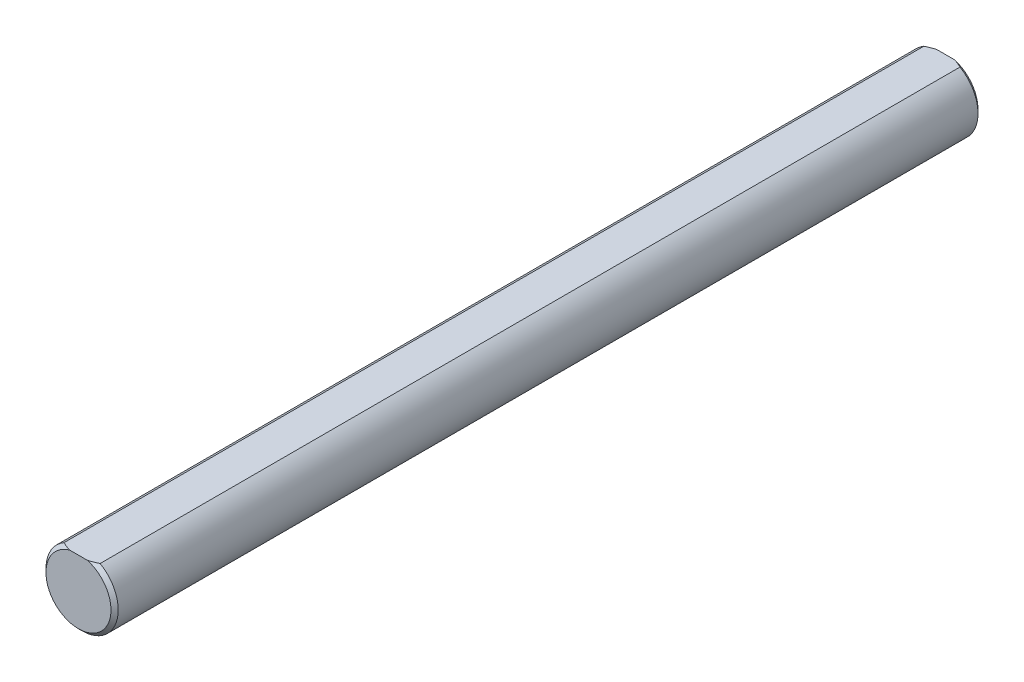
ISO-10303-21;
HEADER;
FILE_DESCRIPTION(('STEP AP214'),'2;1');
FILE_NAME('part.step','',(''),(''),'','','');
FILE_SCHEMA(('AUTOMOTIVE_DESIGN { 1 0 10303 214 1 1 1 1 }'));
ENDSEC;
DATA;
#1=APPLICATION_CONTEXT('core data for automotive mechanical design processes');
#2=APPLICATION_PROTOCOL_DEFINITION('international standard','automotive_design',2000,#1);
#3=PRODUCT_CONTEXT('',#1,'mechanical');
#4=PRODUCT('Part','Part','',(#3));
#5=PRODUCT_RELATED_PRODUCT_CATEGORY('part','',(#4));
#6=PRODUCT_DEFINITION_FORMATION('','',#4);
#7=PRODUCT_DEFINITION_CONTEXT('part definition',#1,'design');
#8=PRODUCT_DEFINITION('design','',#6,#7);
#9=PRODUCT_DEFINITION_SHAPE('','',#8);
#10=(LENGTH_UNIT() NAMED_UNIT(*) SI_UNIT(.MILLI.,.METRE.));
#11=(NAMED_UNIT(*) PLANE_ANGLE_UNIT() SI_UNIT($,.RADIAN.));
#12=(NAMED_UNIT(*) SI_UNIT($,.STERADIAN.) SOLID_ANGLE_UNIT());
#13=UNCERTAINTY_MEASURE_WITH_UNIT(LENGTH_MEASURE(1.E-05),#10,'distance_accuracy_value','');
#14=(GEOMETRIC_REPRESENTATION_CONTEXT(3) GLOBAL_UNCERTAINTY_ASSIGNED_CONTEXT((#13)) GLOBAL_UNIT_ASSIGNED_CONTEXT((#10,
#11,#12)) REPRESENTATION_CONTEXT('',''));
#15=CARTESIAN_POINT('',(0.,0.,0.));
#16=DIRECTION('',(0.,0.,1.));
#17=DIRECTION('',(1.,0.,0.));
#18=AXIS2_PLACEMENT_3D('',#15,#16,#17);
#19=CARTESIAN_POINT('',(0.,0.,76.2));
#20=DIRECTION('',(0.,0.,-1.));
#21=DIRECTION('',(-1.,0.,0.));
#22=AXIS2_PLACEMENT_3D('',#19,#20,#21);
#23=CYLINDRICAL_SURFACE('',#22,6.35);
#24=DIRECTION('',(0.,0.,1.));
#25=VECTOR('',#24,1.);
#26=CARTESIAN_POINT('',(-3.175,5.49926131403118,-76.2));
#27=LINE('',#26,#25);
#28=CARTESIAN_POINT('',(-3.175,5.49926131403118,-75.5649999999999));
#29=VERTEX_POINT('',#28);
#30=CARTESIAN_POINT('',(-3.175,5.49926131403118,75.565));
#31=VERTEX_POINT('',#30);
#32=EDGE_CURVE('E84',#29,#31,#27,.T.);
#33=ORIENTED_EDGE('',*,*,#32,.F.);
#34=CARTESIAN_POINT('',(0.,0.,-75.5649999999999));
#35=DIRECTION('',(0.,0.,1.));
#36=DIRECTION('',(1.,0.,0.));
#37=AXIS2_PLACEMENT_3D('',#34,#35,#36);
#38=CIRCLE('',#37,6.35);
#39=CARTESIAN_POINT('',(3.175,5.49926131403118,-75.5649999999999));
#40=VERTEX_POINT('',#39);
#41=EDGE_CURVE('E95',#29,#40,#38,.T.);
#42=ORIENTED_EDGE('',*,*,#41,.T.);
#43=DIRECTION('',(0.,0.,1.));
#44=VECTOR('',#43,1.);
#45=CARTESIAN_POINT('',(3.175,5.49926131403118,-76.2));
#46=LINE('',#45,#44);
#47=CARTESIAN_POINT('',(3.175,5.49926131403118,75.565));
#48=VERTEX_POINT('',#47);
#49=EDGE_CURVE('E97',#40,#48,#46,.T.);
#50=ORIENTED_EDGE('',*,*,#49,.T.);
#51=CARTESIAN_POINT('',(0.,0.,75.5650000000001));
#52=DIRECTION('',(0.,0.,1.));
#53=DIRECTION('',(1.,0.,0.));
#54=AXIS2_PLACEMENT_3D('',#51,#52,#53);
#55=CIRCLE('',#54,6.35);
#56=EDGE_CURVE('E96',#48,#31,#55,.F.);
#57=ORIENTED_EDGE('',*,*,#56,.T.);
#58=EDGE_LOOP('',(#33,#42,#50,#57));
#59=FACE_BOUND('',#58,.T.);
#60=ADVANCED_FACE('F37',(#59),#23,.T.);
#61=CARTESIAN_POINT('',(0.,0.,76.2));
#62=DIRECTION('',(0.,0.,1.));
#63=DIRECTION('',(1.,0.,0.));
#64=AXIS2_PLACEMENT_3D('',#61,#62,#63);
#65=PLANE('',#64);
#66=DIRECTION('',(1.,0.,0.));
#67=VECTOR('',#66,1.);
#68=CARTESIAN_POINT('',(-3.175,5.49926131403118,76.2));
#69=LINE('',#68,#67);
#70=CARTESIAN_POINT('',(-1.55542598666767,5.49926131403118,76.2));
#71=VERTEX_POINT('',#70);
#72=CARTESIAN_POINT('',(1.55542598666767,5.49926131403118,76.2));
#73=VERTEX_POINT('',#72);
#74=EDGE_CURVE('E142',#71,#73,#69,.T.);
#75=ORIENTED_EDGE('',*,*,#74,.F.);
#76=CARTESIAN_POINT('',(0.,0.,76.2));
#77=DIRECTION('',(0.,0.,1.));
#78=DIRECTION('',(1.,0.,0.));
#79=AXIS2_PLACEMENT_3D('',#76,#77,#78);
#80=CIRCLE('',#79,5.71500000000009);
#81=EDGE_CURVE('E11',#71,#73,#80,.T.);
#82=ORIENTED_EDGE('',*,*,#81,.T.);
#83=EDGE_LOOP('',(#75,#82));
#84=FACE_BOUND('',#83,.T.);
#85=ADVANCED_FACE('F135',(#84),#65,.T.);
#86=CARTESIAN_POINT('',(0.,0.,-76.2));
#87=DIRECTION('',(0.,0.,1.));
#88=DIRECTION('',(1.,0.,0.));
#89=AXIS2_PLACEMENT_3D('',#86,#87,#88);
#90=PLANE('',#89);
#91=DIRECTION('',(1.,0.,0.));
#92=VECTOR('',#91,1.);
#93=CARTESIAN_POINT('',(-3.175,5.49926131403118,-76.2));
#94=LINE('',#93,#92);
#95=CARTESIAN_POINT('',(-1.55542598666685,5.49926131403118,-76.2));
#96=VERTEX_POINT('',#95);
#97=CARTESIAN_POINT('',(1.55542598666685,5.49926131403118,-76.2));
#98=VERTEX_POINT('',#97);
#99=EDGE_CURVE('E86',#96,#98,#94,.T.);
#100=ORIENTED_EDGE('',*,*,#99,.T.);
#101=CARTESIAN_POINT('',(0.,0.,-76.2));
#102=DIRECTION('',(0.,0.,1.));
#103=DIRECTION('',(1.,0.,0.));
#104=AXIS2_PLACEMENT_3D('',#101,#102,#103);
#105=CIRCLE('',#104,5.71499999999987);
#106=EDGE_CURVE('E46',#98,#96,#105,.F.);
#107=ORIENTED_EDGE('',*,*,#106,.T.);
#108=EDGE_LOOP('',(#100,#107));
#109=FACE_BOUND('',#108,.T.);
#110=ADVANCED_FACE('F116',(#109),#90,.F.);
#111=CARTESIAN_POINT('',(-3.175,5.49926131403118,-76.2));
#112=DIRECTION('',(0.,-1.,0.));
#113=DIRECTION('',(0.,0.,-1.));
#114=AXIS2_PLACEMENT_3D('',#111,#112,#113);
#115=PLANE('',#114);
#116=ORIENTED_EDGE('',*,*,#49,.F.);
#117=CARTESIAN_POINT('',(3.175,5.49926131403118,-75.5649999999999));
#118=CARTESIAN_POINT('',(3.04501033398536,5.49926131403118,-75.6299761649596));
#119=CARTESIAN_POINT('',(2.91380376476052,5.49926131403118,-75.6926038152387));
#120=CARTESIAN_POINT('',(2.6491645415403,5.49926131403118,-75.8120517028503));
#121=CARTESIAN_POINT('',(2.51573807775448,5.49926131403118,-75.8688856940337));
#122=CARTESIAN_POINT('',(2.2461783600497,5.49926131403118,-75.9759840114088));
#123=CARTESIAN_POINT('',(2.11004398072325,5.49926131403118,-76.0262455374683));
#124=CARTESIAN_POINT('',(1.8348445135756,5.49926131403118,-76.1191643918951));
#125=CARTESIAN_POINT('',(1.69577308655063,5.49926131403118,-76.1618028710614));
#126=CARTESIAN_POINT('',(1.55542598666685,5.49926131403118,-76.2));
#127=B_SPLINE_CURVE_WITH_KNOTS('',3,(#117,#118,#119,#120,#121,#122,#123,#124,#125,#126),
.UNSPECIFIED.,.F.,.F.,(4,2,2,2,4),(0.,0.436005137555672,0.870949859794538,1.30607928626144,
1.7422701913616),.UNSPECIFIED.);
#128=EDGE_CURVE('E90',#40,#98,#127,.T.);
#129=ORIENTED_EDGE('',*,*,#128,.T.);
#130=ORIENTED_EDGE('',*,*,#99,.F.);
#131=CARTESIAN_POINT('',(-1.55542598666685,5.49926131403118,-76.2));
#132=CARTESIAN_POINT('',(-1.69577308655062,5.49926131403118,-76.1618028710614));
#133=CARTESIAN_POINT('',(-1.83484451357559,5.49926131403118,-76.1191643918951));
#134=CARTESIAN_POINT('',(-2.11004398072325,5.49926131403118,-76.0262455374683));
#135=CARTESIAN_POINT('',(-2.2461783600497,5.49926131403118,-75.9759840114088));
#136=CARTESIAN_POINT('',(-2.51573807775448,5.49926131403118,-75.8688856940337));
#137=CARTESIAN_POINT('',(-2.6491645415403,5.49926131403118,-75.8120517028503));
#138=CARTESIAN_POINT('',(-2.91380376476052,5.49926131403118,-75.6926038152387));
#139=CARTESIAN_POINT('',(-3.04501033398536,5.49926131403118,-75.6299761649596));
#140=CARTESIAN_POINT('',(-3.175,5.49926131403118,-75.5649999999999));
#141=B_SPLINE_CURVE_WITH_KNOTS('',3,(#131,#132,#133,#134,#135,#136,#137,#138,#139,#140),
.UNSPECIFIED.,.F.,.F.,(4,2,2,2,4),(0.,0.43619090510017,0.871320331567069,1.30626505380594,
1.74227019136161),.UNSPECIFIED.);
#142=EDGE_CURVE('E80',#96,#29,#141,.T.);
#143=ORIENTED_EDGE('',*,*,#142,.T.);
#144=ORIENTED_EDGE('',*,*,#32,.T.);
#145=CARTESIAN_POINT('',(-3.175,5.49926131403118,75.5650000000001));
#146=CARTESIAN_POINT('',(-3.04501033398542,5.49926131403118,75.6299761649598));
#147=CARTESIAN_POINT('',(-2.91380376476064,5.49926131403118,75.6926038152388));
#148=CARTESIAN_POINT('',(-2.64916454154055,5.49926131403118,75.8120517028504));
#149=CARTESIAN_POINT('',(-2.5157380777548,5.49926131403118,75.8688856940338));
#150=CARTESIAN_POINT('',(-2.24617836005016,5.49926131403118,75.9759840114088));
#151=CARTESIAN_POINT('',(-2.11004398072378,5.49926131403118,76.0262455374683));
#152=CARTESIAN_POINT('',(-1.83484451357627,5.49926131403118,76.1191643918951));
#153=CARTESIAN_POINT('',(-1.69577308655137,5.49926131403118,76.1618028710614));
#154=CARTESIAN_POINT('',(-1.55542598666767,5.49926131403118,76.2));
#155=B_SPLINE_CURVE_WITH_KNOTS('',3,(#145,#146,#147,#148,#149,#150,#151,#152,#153,#154),
.UNSPECIFIED.,.F.,.F.,(4,2,2,2,4),(0.,0.436005137555465,0.870949859794119,1.30607928626081,
1.74227019136076),.UNSPECIFIED.);
#156=EDGE_CURVE('E60',#31,#71,#155,.T.);
#157=ORIENTED_EDGE('',*,*,#156,.T.);
#158=ORIENTED_EDGE('',*,*,#74,.T.);
#159=CARTESIAN_POINT('',(1.55542598666767,5.49926131403118,76.2));
#160=CARTESIAN_POINT('',(1.69577308655137,5.49926131403118,76.1618028710614));
#161=CARTESIAN_POINT('',(1.83484451357627,5.49926131403118,76.1191643918951));
#162=CARTESIAN_POINT('',(2.11004398072378,5.49926131403118,76.0262455374683));
#163=CARTESIAN_POINT('',(2.24617836005016,5.49926131403118,75.9759840114088));
#164=CARTESIAN_POINT('',(2.5157380777548,5.49926131403118,75.8688856940338));
#165=CARTESIAN_POINT('',(2.64916454154055,5.49926131403118,75.8120517028504));
#166=CARTESIAN_POINT('',(2.91380376476064,5.49926131403118,75.6926038152388));
#167=CARTESIAN_POINT('',(3.04501033398542,5.49926131403118,75.6299761649598));
#168=CARTESIAN_POINT('',(3.175,5.49926131403118,75.5650000000001));
#169=B_SPLINE_CURVE_WITH_KNOTS('',3,(#159,#160,#161,#162,#163,#164,#165,#166,#167,#168),
.UNSPECIFIED.,.F.,.F.,(4,2,2,2,4),(0.,0.436190905099954,0.871320331566643,1.3062650538053,
1.74227019136076),.UNSPECIFIED.);
#170=EDGE_CURVE('E53',#73,#48,#169,.T.);
#171=ORIENTED_EDGE('',*,*,#170,.T.);
#172=EDGE_LOOP('',(#116,#129,#130,#143,#144,#157,#158,#171));
#173=FACE_BOUND('',#172,.T.);
#174=ADVANCED_FACE('F83',(#173),#115,.F.);
#175=CARTESIAN_POINT('',(0.,0.,-75.5649999999999));
#176=DIRECTION('',(0.,0.,1.));
#177=DIRECTION('',(1.,0.,0.));
#178=AXIS2_PLACEMENT_3D('',#175,#176,#177);
#179=CONICAL_SURFACE('',#178,6.35,0.785398163397442);
#180=ORIENTED_EDGE('',*,*,#142,.F.);
#181=ORIENTED_EDGE('',*,*,#106,.F.);
#182=ORIENTED_EDGE('',*,*,#128,.F.);
#183=ORIENTED_EDGE('',*,*,#41,.F.);
#184=EDGE_LOOP('',(#180,#181,#182,#183));
#185=FACE_BOUND('',#184,.T.);
#186=ADVANCED_FACE('F99',(#185),#179,.T.);
#187=CARTESIAN_POINT('',(0.,0.,76.2));
#188=DIRECTION('',(0.,0.,-1.));
#189=DIRECTION('',(-1.,0.,0.));
#190=AXIS2_PLACEMENT_3D('',#187,#188,#189);
#191=CONICAL_SURFACE('',#190,5.71500000000009,0.785398163397442);
#192=ORIENTED_EDGE('',*,*,#156,.F.);
#193=ORIENTED_EDGE('',*,*,#56,.F.);
#194=ORIENTED_EDGE('',*,*,#170,.F.);
#195=ORIENTED_EDGE('',*,*,#81,.F.);
#196=EDGE_LOOP('',(#192,#193,#194,#195));
#197=FACE_BOUND('',#196,.T.);
#198=ADVANCED_FACE('F39',(#197),#191,.T.);
#199=CLOSED_SHELL('',(#60,#85,#110,#174,#186,#198));
#200=MANIFOLD_SOLID_BREP('B2',#199);
#201=ADVANCED_BREP_SHAPE_REPRESENTATION('',(#18,#200),#14);
#202=SHAPE_DEFINITION_REPRESENTATION(#9,#201);
ENDSEC;
END-ISO-10303-21;
